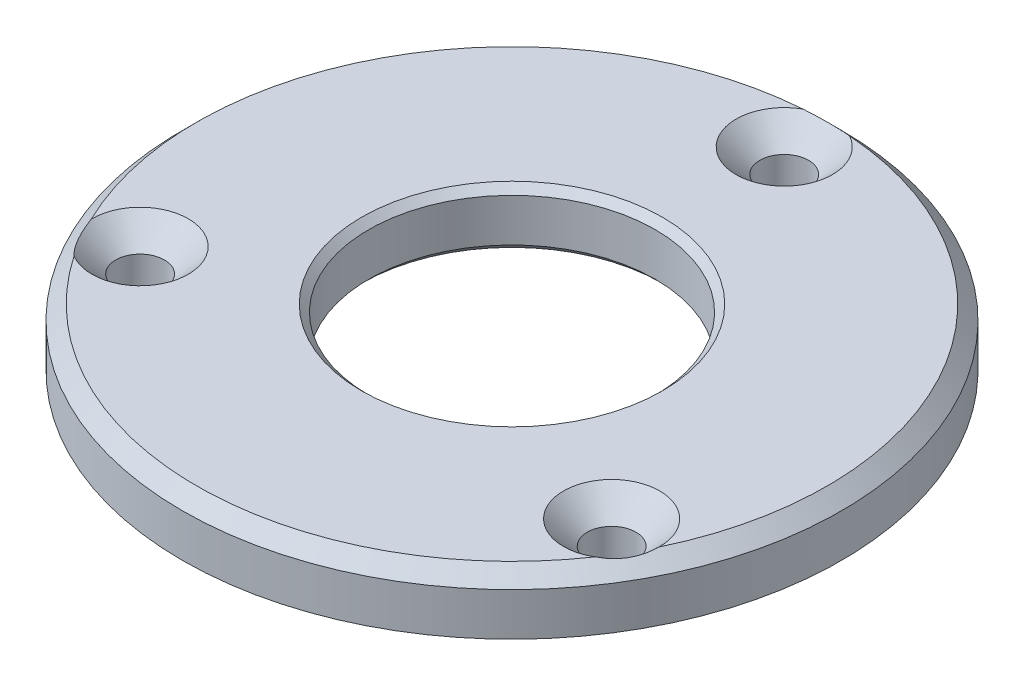
ISO-10303-21;
HEADER;
FILE_DESCRIPTION(('STEP AP214'),'2;1');
FILE_NAME('part.step','',(''),(''),'','','');
FILE_SCHEMA(('AUTOMOTIVE_DESIGN { 1 0 10303 214 1 1 1 1 }'));
ENDSEC;
DATA;
#1=APPLICATION_CONTEXT('core data for automotive mechanical design processes');
#2=APPLICATION_PROTOCOL_DEFINITION('international standard','automotive_design',2000,#1);
#3=PRODUCT_CONTEXT('',#1,'mechanical');
#4=PRODUCT('Part','Part','',(#3));
#5=PRODUCT_RELATED_PRODUCT_CATEGORY('part','',(#4));
#6=PRODUCT_DEFINITION_FORMATION('','',#4);
#7=PRODUCT_DEFINITION_CONTEXT('part definition',#1,'design');
#8=PRODUCT_DEFINITION('design','',#6,#7);
#9=PRODUCT_DEFINITION_SHAPE('','',#8);
#10=(LENGTH_UNIT() NAMED_UNIT(*) SI_UNIT(.MILLI.,.METRE.));
#11=(NAMED_UNIT(*) PLANE_ANGLE_UNIT() SI_UNIT($,.RADIAN.));
#12=(NAMED_UNIT(*) SI_UNIT($,.STERADIAN.) SOLID_ANGLE_UNIT());
#13=UNCERTAINTY_MEASURE_WITH_UNIT(LENGTH_MEASURE(1.E-05),#10,'distance_accuracy_value','');
#14=(GEOMETRIC_REPRESENTATION_CONTEXT(3) GLOBAL_UNCERTAINTY_ASSIGNED_CONTEXT((#13)) GLOBAL_UNIT_ASSIGNED_CONTEXT((#10,
#11,#12)) REPRESENTATION_CONTEXT('',''));
#15=CARTESIAN_POINT('',(0.,0.,0.));
#16=DIRECTION('',(0.,0.,1.));
#17=DIRECTION('',(1.,0.,0.));
#18=AXIS2_PLACEMENT_3D('',#15,#16,#17);
#19=CARTESIAN_POINT('',(0.,4.,0.));
#20=DIRECTION('',(0.,1.,0.));
#21=DIRECTION('',(0.,0.,1.));
#22=AXIS2_PLACEMENT_3D('',#19,#20,#21);
#23=PLANE('',#22);
#24=CARTESIAN_POINT('',(0.,4.,-19.));
#25=DIRECTION('',(0.,1.,0.));
#26=DIRECTION('',(0.,0.,1.));
#27=AXIS2_PLACEMENT_3D('',#24,#25,#26);
#28=CIRCLE('',#27,3.36);
#29=CARTESIAN_POINT('',(-1.62710952608039,4.,-21.939747368421));
#30=VERTEX_POINT('',#29);
#31=CARTESIAN_POINT('',(1.62710952608038,4.,-21.939747368421));
#32=VERTEX_POINT('',#31);
#33=EDGE_CURVE('E70',#30,#32,#28,.T.);
#34=ORIENTED_EDGE('',*,*,#33,.F.);
#35=CARTESIAN_POINT('',(0.,4.,0.));
#36=DIRECTION('',(0.,1.,0.));
#37=DIRECTION('',(0.,0.,1.));
#38=AXIS2_PLACEMENT_3D('',#35,#36,#37);
#39=CIRCLE('',#38,22.);
#40=CARTESIAN_POINT('',(-19.8139333367056,4.,9.56075549988526));
#41=VERTEX_POINT('',#40);
#42=EDGE_CURVE('E97',#30,#41,#39,.T.);
#43=ORIENTED_EDGE('',*,*,#42,.T.);
#44=CARTESIAN_POINT('',(-16.4544826719043,4.,9.5));
#45=DIRECTION('',(0.,1.,0.));
#46=DIRECTION('',(0.,0.,1.));
#47=AXIS2_PLACEMENT_3D('',#44,#45,#46);
#48=CIRCLE('',#47,3.36);
#49=CARTESIAN_POINT('',(-18.1868238106252,4.,12.3789918685358));
#50=VERTEX_POINT('',#49);
#51=EDGE_CURVE('E203',#50,#41,#48,.T.);
#52=ORIENTED_EDGE('',*,*,#51,.F.);
#53=CARTESIAN_POINT('',(18.1868238106252,4.,12.3789918685358));
#54=VERTEX_POINT('',#53);
#55=EDGE_CURVE('E110',#50,#54,#39,.T.);
#56=ORIENTED_EDGE('',*,*,#55,.T.);
#57=CARTESIAN_POINT('',(16.4544826719043,4.,9.5));
#58=DIRECTION('',(0.,1.,0.));
#59=DIRECTION('',(0.,0.,1.));
#60=AXIS2_PLACEMENT_3D('',#57,#58,#59);
#61=CIRCLE('',#60,3.36);
#62=CARTESIAN_POINT('',(19.8139333367056,4.,9.56075549988525));
#63=VERTEX_POINT('',#62);
#64=EDGE_CURVE('E77',#63,#54,#61,.T.);
#65=ORIENTED_EDGE('',*,*,#64,.F.);
#66=EDGE_CURVE('E99',#63,#32,#39,.T.);
#67=ORIENTED_EDGE('',*,*,#66,.T.);
#68=EDGE_LOOP('',(#34,#43,#52,#56,#65,#67));
#69=FACE_BOUND('',#68,.T.);
#70=CARTESIAN_POINT('',(0.,4.,0.));
#71=DIRECTION('',(0.,1.,0.));
#72=DIRECTION('',(0.,0.,1.));
#73=AXIS2_PLACEMENT_3D('',#70,#71,#72);
#74=CIRCLE('',#73,10.5);
#75=CARTESIAN_POINT('',(0.,4.,10.5));
#76=VERTEX_POINT('',#75);
#77=EDGE_CURVE('E108',#76,#76,#74,.F.);
#78=ORIENTED_EDGE('',*,*,#77,.T.);
#79=EDGE_LOOP('',(#78));
#80=FACE_BOUND('',#79,.T.);
#81=ADVANCED_FACE('F49',(#69,#80),#23,.T.);
#82=CARTESIAN_POINT('',(0.,0.,0.));
#83=DIRECTION('',(0.,1.,0.));
#84=DIRECTION('',(0.,0.,1.));
#85=AXIS2_PLACEMENT_3D('',#82,#83,#84);
#86=PLANE('',#85);
#87=CARTESIAN_POINT('',(0.,0.,-19.));
#88=DIRECTION('',(0.,1.,0.));
#89=DIRECTION('',(0.,0.,1.));
#90=AXIS2_PLACEMENT_3D('',#87,#88,#89);
#91=CIRCLE('',#90,1.7);
#92=CARTESIAN_POINT('',(0.,0.,-17.3));
#93=VERTEX_POINT('',#92);
#94=EDGE_CURVE('E216',#93,#93,#91,.T.);
#95=ORIENTED_EDGE('',*,*,#94,.T.);
#96=EDGE_LOOP('',(#95));
#97=FACE_BOUND('',#96,.T.);
#98=CARTESIAN_POINT('',(16.4544826719043,0.,9.5));
#99=DIRECTION('',(0.,1.,0.));
#100=DIRECTION('',(0.,0.,1.));
#101=AXIS2_PLACEMENT_3D('',#98,#99,#100);
#102=CIRCLE('',#101,1.7);
#103=CARTESIAN_POINT('',(16.4544826719043,0.,11.2));
#104=VERTEX_POINT('',#103);
#105=EDGE_CURVE('E206',#104,#104,#102,.T.);
#106=ORIENTED_EDGE('',*,*,#105,.T.);
#107=EDGE_LOOP('',(#106));
#108=FACE_BOUND('',#107,.T.);
#109=CARTESIAN_POINT('',(-16.4544826719043,0.,9.5));
#110=DIRECTION('',(0.,1.,0.));
#111=DIRECTION('',(0.,0.,1.));
#112=AXIS2_PLACEMENT_3D('',#109,#110,#111);
#113=CIRCLE('',#112,1.7);
#114=CARTESIAN_POINT('',(-16.4544826719043,0.,11.2));
#115=VERTEX_POINT('',#114);
#116=EDGE_CURVE('E195',#115,#115,#113,.T.);
#117=ORIENTED_EDGE('',*,*,#116,.T.);
#118=EDGE_LOOP('',(#117));
#119=FACE_BOUND('',#118,.T.);
#120=CARTESIAN_POINT('',(0.,0.,0.));
#121=DIRECTION('',(0.,1.,0.));
#122=DIRECTION('',(0.,0.,1.));
#123=AXIS2_PLACEMENT_3D('',#120,#121,#122);
#124=CIRCLE('',#123,10.5);
#125=CARTESIAN_POINT('',(0.,0.,10.5));
#126=VERTEX_POINT('',#125);
#127=EDGE_CURVE('E182',#126,#126,#124,.T.);
#128=ORIENTED_EDGE('',*,*,#127,.T.);
#129=EDGE_LOOP('',(#128));
#130=FACE_BOUND('',#129,.T.);
#131=CARTESIAN_POINT('',(0.,0.,0.));
#132=DIRECTION('',(0.,1.,0.));
#133=DIRECTION('',(0.,0.,1.));
#134=AXIS2_PLACEMENT_3D('',#131,#132,#133);
#135=CIRCLE('',#134,23.);
#136=CARTESIAN_POINT('',(0.,0.,23.));
#137=VERTEX_POINT('',#136);
#138=EDGE_CURVE('E189',#137,#137,#135,.T.);
#139=ORIENTED_EDGE('',*,*,#138,.F.);
#140=EDGE_LOOP('',(#139));
#141=FACE_BOUND('',#140,.T.);
#142=ADVANCED_FACE('F155',(#97,#108,#119,#130,#141),#86,.F.);
#143=CARTESIAN_POINT('',(0.,4.,0.));
#144=DIRECTION('',(0.,-1.,0.));
#145=DIRECTION('',(0.,0.,-1.));
#146=AXIS2_PLACEMENT_3D('',#143,#144,#145);
#147=CYLINDRICAL_SURFACE('',#146,23.);
#148=CARTESIAN_POINT('',(0.,2.99999999999999,0.));
#149=DIRECTION('',(0.,1.,0.));
#150=DIRECTION('',(0.,0.,1.));
#151=AXIS2_PLACEMENT_3D('',#148,#149,#150);
#152=CIRCLE('',#151,23.);
#153=CARTESIAN_POINT('',(0.,2.99999999999999,23.));
#154=VERTEX_POINT('',#153);
#155=EDGE_CURVE('E119',#154,#154,#152,.F.);
#156=ORIENTED_EDGE('',*,*,#155,.T.);
#157=EDGE_LOOP('',(#156));
#158=FACE_BOUND('',#157,.T.);
#159=ORIENTED_EDGE('',*,*,#138,.T.);
#160=EDGE_LOOP('',(#159));
#161=FACE_BOUND('',#160,.T.);
#162=ADVANCED_FACE('F151',(#158,#161),#147,.T.);
#163=CARTESIAN_POINT('',(0.,4.,0.));
#164=DIRECTION('',(0.,-1.,0.));
#165=DIRECTION('',(0.,0.,-1.));
#166=AXIS2_PLACEMENT_3D('',#163,#164,#165);
#167=CYLINDRICAL_SURFACE('',#166,10.);
#168=CARTESIAN_POINT('',(0.,0.500000000000002,0.));
#169=DIRECTION('',(0.,1.,0.));
#170=DIRECTION('',(0.,0.,1.));
#171=AXIS2_PLACEMENT_3D('',#168,#169,#170);
#172=CIRCLE('',#171,10.);
#173=CARTESIAN_POINT('',(0.,0.500000000000002,10.));
#174=VERTEX_POINT('',#173);
#175=EDGE_CURVE('E114',#174,#174,#172,.F.);
#176=ORIENTED_EDGE('',*,*,#175,.T.);
#177=EDGE_LOOP('',(#176));
#178=FACE_BOUND('',#177,.T.);
#179=CARTESIAN_POINT('',(0.,3.49999999999998,0.));
#180=DIRECTION('',(0.,1.,0.));
#181=DIRECTION('',(0.,0.,1.));
#182=AXIS2_PLACEMENT_3D('',#179,#180,#181);
#183=CIRCLE('',#182,10.);
#184=CARTESIAN_POINT('',(0.,3.49999999999998,10.));
#185=VERTEX_POINT('',#184);
#186=EDGE_CURVE('E179',#185,#185,#183,.T.);
#187=ORIENTED_EDGE('',*,*,#186,.T.);
#188=EDGE_LOOP('',(#187));
#189=FACE_BOUND('',#188,.T.);
#190=ADVANCED_FACE('F147',(#178,#189),#167,.F.);
#191=CARTESIAN_POINT('',(0.,0.,0.));
#192=DIRECTION('',(0.,-1.,0.));
#193=DIRECTION('',(0.,0.,-1.));
#194=AXIS2_PLACEMENT_3D('',#191,#192,#193);
#195=CONICAL_SURFACE('',#194,10.5,0.785398163397441);
#196=ORIENTED_EDGE('',*,*,#175,.F.);
#197=EDGE_LOOP('',(#196));
#198=FACE_BOUND('',#197,.T.);
#199=ORIENTED_EDGE('',*,*,#127,.F.);
#200=EDGE_LOOP('',(#199));
#201=FACE_BOUND('',#200,.T.);
#202=ADVANCED_FACE('F150',(#198,#201),#195,.F.);
#203=CARTESIAN_POINT('',(0.,3.49999999999998,0.));
#204=DIRECTION('',(0.,1.,0.));
#205=DIRECTION('',(0.,0.,1.));
#206=AXIS2_PLACEMENT_3D('',#203,#204,#205);
#207=CONICAL_SURFACE('',#206,10.,0.785398163397462);
#208=ORIENTED_EDGE('',*,*,#77,.F.);
#209=EDGE_LOOP('',(#208));
#210=FACE_BOUND('',#209,.T.);
#211=ORIENTED_EDGE('',*,*,#186,.F.);
#212=EDGE_LOOP('',(#211));
#213=FACE_BOUND('',#212,.T.);
#214=ADVANCED_FACE('F166',(#210,#213),#207,.F.);
#215=CARTESIAN_POINT('',(0.,4.,0.));
#216=DIRECTION('',(0.,-1.,0.));
#217=DIRECTION('',(0.,0.,-1.));
#218=AXIS2_PLACEMENT_3D('',#215,#216,#217);
#219=CONICAL_SURFACE('',#218,22.,0.785398163397448);
#220=CARTESIAN_POINT('',(1.62800457439416,4.0002,-21.9394804210526));
#221=CARTESIAN_POINT('',(1.49975834008952,3.97150965787139,-21.9777744777916));
#222=CARTESIAN_POINT('',(1.36951434970222,3.94594228552399,-22.0119001916536));
#223=CARTESIAN_POINT('',(1.10580262214334,3.90150798388738,-22.0712082911105));
#224=CARTESIAN_POINT('',(0.972332874978416,3.88264535366983,-22.096384938576));
#225=CARTESIAN_POINT('',(0.707330987424486,3.85259191904876,-22.1364983649361));
#226=CARTESIAN_POINT('',(0.575869429529129,3.84117899085878,-22.1517316206324));
#227=CARTESIAN_POINT('',(0.311821369053307,3.82537329727135,-22.1728280621612));
#228=CARTESIAN_POINT('',(0.179235278051607,3.82097806616716,-22.1786945390633));
#229=CARTESIAN_POINT('',(-0.0935709313704069,3.81926716326456,-22.1809781441788));
#230=CARTESIAN_POINT('',(-0.233798924621231,3.82236572311436,-22.1768423821469));
#231=CARTESIAN_POINT('',(-0.51320342730982,3.8364332351542,-22.1580659556641));
#232=CARTESIAN_POINT('',(-0.652379405102914,3.84740592873985,-22.1434202974347));
#233=CARTESIAN_POINT('',(-0.933210951592037,3.87743861264275,-22.1033345679188));
#234=CARTESIAN_POINT('',(-1.07478844469072,3.89676245006569,-22.077542330174));
#235=CARTESIAN_POINT('',(-1.2844357296501,3.93142095445563,-22.0312823472689));
#236=CARTESIAN_POINT('',(-1.35385032711518,3.94391594264939,-22.0146048260846));
#237=CARTESIAN_POINT('',(-1.49168887782016,3.97071801379702,-21.9788311141549));
#238=CARTESIAN_POINT('',(-1.56011297650083,3.98502482763974,-21.959735282602));
#239=CARTESIAN_POINT('',(-1.62800457439416,4.0002,-21.9394804210526));
#240=B_SPLINE_CURVE_WITH_KNOTS('',3,(#220,#221,#222,#223,#224,#225,#226,#227,#228,#229,#230,
#231,#232,#233,#234,#235,#236,#237,#238,#239),.UNSPECIFIED.,.F.,.F.,(4,2,2,2,2,2,2,2,2,4),(0.,
0.410611232620792,0.821485275682876,1.2194688771939,1.61731261416638,2.03764533283592,
2.45817790500219,2.89309817426617,3.11046460831723,3.32779879463382),.UNSPECIFIED.);
#241=EDGE_CURVE('E11',#32,#30,#240,.T.);
#242=ORIENTED_EDGE('',*,*,#241,.F.);
#243=ORIENTED_EDGE('',*,*,#66,.F.);
#244=CARTESIAN_POINT('',(18.1861451032658,4.0002,12.3796335294289));
#245=CARTESIAN_POINT('',(18.2834318463681,3.97150965787138,12.2877160609509));
#246=CARTESIAN_POINT('',(18.3781075766885,3.94594228552399,12.1919843135163));
#247=CARTESIAN_POINT('',(18.5613257612478,3.90150798388738,11.9932573079028));
#248=CARTESIAN_POINT('',(18.6498642511174,3.88264535366983,11.8902574399541));
#249=CARTESIAN_POINT('',(18.8171044411551,3.85259191904876,11.6808157864616));
#250=CARTESIAN_POINT('',(18.8960276065181,3.84117899085878,11.5745833655513));
#251=CARTESIAN_POINT('',(19.0463216910494,3.82537329727135,11.3564592581236));
#252=CARTESIAN_POINT('',(19.1176952545782,3.82097806616716,11.2445695735787));
#253=CARTESIAN_POINT('',(19.2560760193315,3.81926716326456,11.0094542684669));
#254=CARTESIAN_POINT('',(19.3226083409733,3.82236572311436,10.885945382974));
#255=CARTESIAN_POINT('',(19.4460497299912,3.8364332351542,10.6345857724725));
#256=CARTESIAN_POINT('',(19.5029542068059,3.84740592873985,10.5067330109925));
#257=CARTESIAN_POINT('',(19.6086547199604,3.87743861264275,10.2434828927908));
#258=CARTESIAN_POINT('',(19.6571067334023,3.89676245006569,10.1079770682909));
#259=CARTESIAN_POINT('',(19.7218680555075,3.93142095445563,9.90328720222905));
#260=CARTESIAN_POINT('',(19.7421321972224,3.94391594264939,9.83483363683869));
#261=CARTESIAN_POINT('',(19.7800705292561,3.97071801379702,9.6975750943425));
#262=CARTESIAN_POINT('',(19.7977451033652,3.98502482763973,9.62877017087755));
#263=CARTESIAN_POINT('',(19.81414967766,4.0002,9.55984689162371));
#264=B_SPLINE_CURVE_WITH_KNOTS('',3,(#244,#245,#246,#247,#248,#249,#250,#251,#252,#253,#254,
#255,#256,#257,#258,#259,#260,#261,#262,#263),.UNSPECIFIED.,.F.,.F.,(4,2,2,2,2,2,2,2,2,4),(0.,
0.410611232620791,0.821485275682874,1.2194688771939,1.61731261416637,2.03764533283592,
2.45817790500218,2.89309817426616,3.11046460831722,3.3277987946338),.UNSPECIFIED.);
#265=EDGE_CURVE('E65',#54,#63,#264,.T.);
#266=ORIENTED_EDGE('',*,*,#265,.F.);
#267=ORIENTED_EDGE('',*,*,#55,.F.);
#268=CARTESIAN_POINT('',(-19.81414967766,4.0002,9.55984689162371));
#269=CARTESIAN_POINT('',(-19.7831901864576,3.97150965787138,9.69005841684071));
#270=CARTESIAN_POINT('',(-19.7476219263907,3.94594228552398,9.81991587813739));
#271=CARTESIAN_POINT('',(-19.6671283833911,3.90150798388738,10.0779509832077));
#272=CARTESIAN_POINT('',(-19.6221971260958,3.88264535366983,10.2061274986219));
#273=CARTESIAN_POINT('',(-19.5244354285796,3.85259191904876,10.4556825784745));
#274=CARTESIAN_POINT('',(-19.4718970360472,3.84117899085878,10.5771482550811));
#275=CARTESIAN_POINT('',(-19.3581430601027,3.82537329727135,10.8163688040376));
#276=CARTESIAN_POINT('',(-19.2969305326298,3.82097806616716,10.9341249654846));
#277=CARTESIAN_POINT('',(-19.1625050879611,3.81926716326456,11.171523875712));
#278=CARTESIAN_POINT('',(-19.088809416352,3.82236572311436,11.2908969991729));
#279=CARTESIAN_POINT('',(-18.9328463026813,3.8364332351542,11.5234801831916));
#280=CARTESIAN_POINT('',(-18.850574801703,3.84740592873986,11.6366872864423));
#281=CARTESIAN_POINT('',(-18.6754437683684,3.87743861264275,11.8598516751279));
#282=CARTESIAN_POINT('',(-18.5823182887116,3.89676245006569,11.9695652618831));
#283=CARTESIAN_POINT('',(-18.4374323258574,3.93142095445563,12.1279951450398));
#284=CARTESIAN_POINT('',(-18.3882818701072,3.94391594264939,12.1797711892459));
#285=CARTESIAN_POINT('',(-18.2883816514359,3.97071801379702,12.2812560198124));
#286=CARTESIAN_POINT('',(-18.2376321268644,3.98502482763974,12.3309651117245));
#287=CARTESIAN_POINT('',(-18.1861451032658,4.0002,12.3796335294289));
#288=B_SPLINE_CURVE_WITH_KNOTS('',3,(#268,#269,#270,#271,#272,#273,#274,#275,#276,#277,#278,
#279,#280,#281,#282,#283,#284,#285,#286,#287),.UNSPECIFIED.,.F.,.F.,(4,2,2,2,2,2,2,2,2,4),(0.,
0.410611232620795,0.821485275682877,1.2194688771939,1.61731261416638,2.03764533283592,
2.45817790500218,2.89309817426615,3.11046460831721,3.32779879463379),.UNSPECIFIED.);
#289=EDGE_CURVE('E106',#41,#50,#288,.T.);
#290=ORIENTED_EDGE('',*,*,#289,.F.);
#291=ORIENTED_EDGE('',*,*,#42,.F.);
#292=EDGE_LOOP('',(#242,#243,#266,#267,#290,#291));
#293=FACE_BOUND('',#292,.T.);
#294=ORIENTED_EDGE('',*,*,#155,.F.);
#295=EDGE_LOOP('',(#294));
#296=FACE_BOUND('',#295,.T.);
#297=ADVANCED_FACE('F52',(#293,#296),#219,.T.);
#298=CARTESIAN_POINT('',(-16.4544826719043,4.,9.5));
#299=DIRECTION('',(0.,1.,0.));
#300=DIRECTION('',(0.,0.,1.));
#301=AXIS2_PLACEMENT_3D('',#298,#299,#300);
#302=CYLINDRICAL_SURFACE('',#301,1.7);
#303=ORIENTED_EDGE('',*,*,#116,.F.);
#304=EDGE_LOOP('',(#303));
#305=FACE_BOUND('',#304,.T.);
#306=CARTESIAN_POINT('',(-16.4544826719043,2.34,9.5));
#307=DIRECTION('',(0.,1.,0.));
#308=DIRECTION('',(0.,0.,1.));
#309=AXIS2_PLACEMENT_3D('',#306,#307,#308);
#310=CIRCLE('',#309,1.7);
#311=CARTESIAN_POINT('',(-16.4544826719043,2.34,11.2));
#312=VERTEX_POINT('',#311);
#313=EDGE_CURVE('E199',#312,#312,#310,.T.);
#314=ORIENTED_EDGE('',*,*,#313,.T.);
#315=EDGE_LOOP('',(#314));
#316=FACE_BOUND('',#315,.T.);
#317=ADVANCED_FACE('F142',(#305,#316),#302,.F.);
#318=CARTESIAN_POINT('',(-16.4544826719043,4.,9.5));
#319=DIRECTION('',(0.,1.,0.));
#320=DIRECTION('',(0.,0.,1.));
#321=AXIS2_PLACEMENT_3D('',#318,#319,#320);
#322=CONICAL_SURFACE('',#321,3.36,0.785398163397449);
#323=ORIENTED_EDGE('',*,*,#289,.T.);
#324=ORIENTED_EDGE('',*,*,#51,.T.);
#325=EDGE_LOOP('',(#323,#324));
#326=FACE_BOUND('',#325,.T.);
#327=ORIENTED_EDGE('',*,*,#313,.F.);
#328=EDGE_LOOP('',(#327));
#329=FACE_BOUND('',#328,.T.);
#330=ADVANCED_FACE('F136',(#326,#329),#322,.F.);
#331=CARTESIAN_POINT('',(16.4544826719043,4.,9.5));
#332=DIRECTION('',(0.,1.,0.));
#333=DIRECTION('',(0.,0.,1.));
#334=AXIS2_PLACEMENT_3D('',#331,#332,#333);
#335=CYLINDRICAL_SURFACE('',#334,1.7);
#336=ORIENTED_EDGE('',*,*,#105,.F.);
#337=EDGE_LOOP('',(#336));
#338=FACE_BOUND('',#337,.T.);
#339=CARTESIAN_POINT('',(16.4544826719043,2.34,9.5));
#340=DIRECTION('',(0.,1.,0.));
#341=DIRECTION('',(0.,0.,1.));
#342=AXIS2_PLACEMENT_3D('',#339,#340,#341);
#343=CIRCLE('',#342,1.7);
#344=CARTESIAN_POINT('',(16.4544826719043,2.34,11.2));
#345=VERTEX_POINT('',#344);
#346=EDGE_CURVE('E210',#345,#345,#343,.T.);
#347=ORIENTED_EDGE('',*,*,#346,.T.);
#348=EDGE_LOOP('',(#347));
#349=FACE_BOUND('',#348,.T.);
#350=ADVANCED_FACE('F141',(#338,#349),#335,.F.);
#351=CARTESIAN_POINT('',(16.4544826719043,4.,9.5));
#352=DIRECTION('',(0.,1.,0.));
#353=DIRECTION('',(0.,0.,1.));
#354=AXIS2_PLACEMENT_3D('',#351,#352,#353);
#355=CONICAL_SURFACE('',#354,3.36,0.785398163397449);
#356=ORIENTED_EDGE('',*,*,#265,.T.);
#357=ORIENTED_EDGE('',*,*,#64,.T.);
#358=EDGE_LOOP('',(#356,#357));
#359=FACE_BOUND('',#358,.T.);
#360=ORIENTED_EDGE('',*,*,#346,.F.);
#361=EDGE_LOOP('',(#360));
#362=FACE_BOUND('',#361,.T.);
#363=ADVANCED_FACE('F229',(#359,#362),#355,.F.);
#364=CARTESIAN_POINT('',(0.,4.,-19.));
#365=DIRECTION('',(0.,1.,0.));
#366=DIRECTION('',(0.,0.,1.));
#367=AXIS2_PLACEMENT_3D('',#364,#365,#366);
#368=CYLINDRICAL_SURFACE('',#367,1.7);
#369=ORIENTED_EDGE('',*,*,#94,.F.);
#370=EDGE_LOOP('',(#369));
#371=FACE_BOUND('',#370,.T.);
#372=CARTESIAN_POINT('',(0.,2.34,-19.));
#373=DIRECTION('',(0.,1.,0.));
#374=DIRECTION('',(0.,0.,1.));
#375=AXIS2_PLACEMENT_3D('',#372,#373,#374);
#376=CIRCLE('',#375,1.7);
#377=CARTESIAN_POINT('',(0.,2.34,-17.3));
#378=VERTEX_POINT('',#377);
#379=EDGE_CURVE('E101',#378,#378,#376,.T.);
#380=ORIENTED_EDGE('',*,*,#379,.T.);
#381=EDGE_LOOP('',(#380));
#382=FACE_BOUND('',#381,.T.);
#383=ADVANCED_FACE('F224',(#371,#382),#368,.F.);
#384=CARTESIAN_POINT('',(0.,4.,-19.));
#385=DIRECTION('',(0.,1.,0.));
#386=DIRECTION('',(0.,0.,1.));
#387=AXIS2_PLACEMENT_3D('',#384,#385,#386);
#388=CONICAL_SURFACE('',#387,3.36,0.785398163397449);
#389=ORIENTED_EDGE('',*,*,#241,.T.);
#390=ORIENTED_EDGE('',*,*,#33,.T.);
#391=EDGE_LOOP('',(#389,#390));
#392=FACE_BOUND('',#391,.T.);
#393=ORIENTED_EDGE('',*,*,#379,.F.);
#394=EDGE_LOOP('',(#393));
#395=FACE_BOUND('',#394,.T.);
#396=ADVANCED_FACE('F88',(#392,#395),#388,.F.);
#397=CLOSED_SHELL('',(#81,#142,#162,#190,#202,#214,#297,#317,#330,#350,#363,#383,#396));
#398=MANIFOLD_SOLID_BREP('B2',#397);
#399=ADVANCED_BREP_SHAPE_REPRESENTATION('',(#18,#398),#14);
#400=SHAPE_DEFINITION_REPRESENTATION(#9,#399);
ENDSEC;
END-ISO-10303-21;
